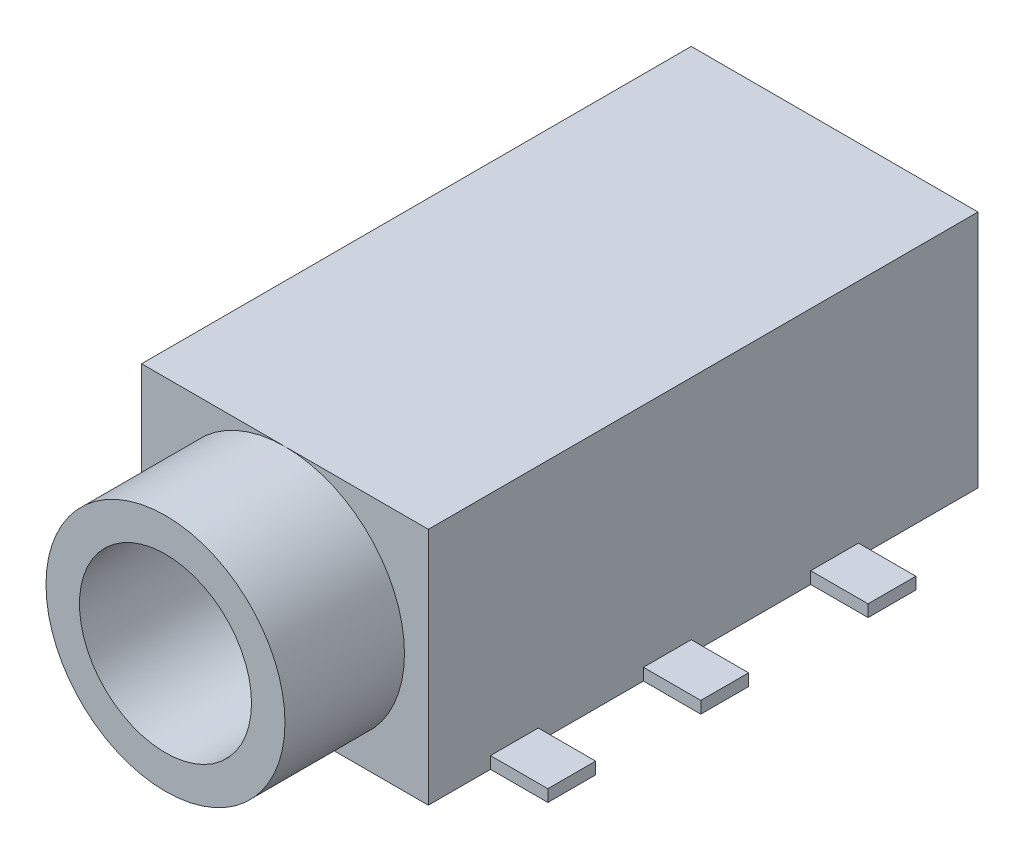
ISO-10303-21;
HEADER;
FILE_DESCRIPTION(('STEP AP214'),'2;1');
FILE_NAME('part.step','',(''),(''),'','','');
FILE_SCHEMA(('AUTOMOTIVE_DESIGN { 1 0 10303 214 1 1 1 1 }'));
ENDSEC;
DATA;
#1=APPLICATION_CONTEXT('core data for automotive mechanical design processes');
#2=APPLICATION_PROTOCOL_DEFINITION('international standard','automotive_design',2000,#1);
#3=PRODUCT_CONTEXT('',#1,'mechanical');
#4=PRODUCT('Part','Part','',(#3));
#5=PRODUCT_RELATED_PRODUCT_CATEGORY('part','',(#4));
#6=PRODUCT_DEFINITION_FORMATION('','',#4);
#7=PRODUCT_DEFINITION_CONTEXT('part definition',#1,'design');
#8=PRODUCT_DEFINITION('design','',#6,#7);
#9=PRODUCT_DEFINITION_SHAPE('','',#8);
#10=(LENGTH_UNIT() NAMED_UNIT(*) SI_UNIT(.MILLI.,.METRE.));
#11=(NAMED_UNIT(*) PLANE_ANGLE_UNIT() SI_UNIT($,.RADIAN.));
#12=(NAMED_UNIT(*) SI_UNIT($,.STERADIAN.) SOLID_ANGLE_UNIT());
#13=UNCERTAINTY_MEASURE_WITH_UNIT(LENGTH_MEASURE(1.E-05),#10,'distance_accuracy_value','');
#14=(GEOMETRIC_REPRESENTATION_CONTEXT(3) GLOBAL_UNCERTAINTY_ASSIGNED_CONTEXT((#13)) GLOBAL_UNIT_ASSIGNED_CONTEXT((#10,
#11,#12)) REPRESENTATION_CONTEXT('',''));
#15=CARTESIAN_POINT('',(0.,0.,0.));
#16=DIRECTION('',(0.,0.,1.));
#17=DIRECTION('',(1.,0.,0.));
#18=AXIS2_PLACEMENT_3D('',#15,#16,#17);
#19=CARTESIAN_POINT('',(3.,5.,0.));
#20=DIRECTION('',(-1.,0.,0.));
#21=DIRECTION('',(0.,0.,1.));
#22=AXIS2_PLACEMENT_3D('',#19,#20,#21);
#23=PLANE('',#22);
#24=DIRECTION('',(0.,-1.,0.));
#25=VECTOR('',#24,1.);
#26=CARTESIAN_POINT('',(3.,0.,-8.));
#27=LINE('',#26,#25);
#28=CARTESIAN_POINT('',(3.,0.250000000000001,-8.));
#29=VERTEX_POINT('',#28);
#30=CARTESIAN_POINT('',(3.,0.,-8.));
#31=VERTEX_POINT('',#30);
#32=EDGE_CURVE('E337',#29,#31,#27,.T.);
#33=ORIENTED_EDGE('',*,*,#32,.F.);
#34=DIRECTION('',(0.,0.,1.));
#35=VECTOR('',#34,1.);
#36=CARTESIAN_POINT('',(3.,0.25,-8.));
#37=LINE('',#36,#35);
#38=CARTESIAN_POINT('',(3.,0.250000000000001,-9.));
#39=VERTEX_POINT('',#38);
#40=EDGE_CURVE('E342',#39,#29,#37,.T.);
#41=ORIENTED_EDGE('',*,*,#40,.F.);
#42=DIRECTION('',(0.,1.,0.));
#43=VECTOR('',#42,1.);
#44=CARTESIAN_POINT('',(3.,0.,-9.));
#45=LINE('',#44,#43);
#46=CARTESIAN_POINT('',(3.,0.,-9.));
#47=VERTEX_POINT('',#46);
#48=EDGE_CURVE('E351',#47,#39,#45,.T.);
#49=ORIENTED_EDGE('',*,*,#48,.F.);
#50=DIRECTION('',(0.,0.,-1.));
#51=VECTOR('',#50,1.);
#52=CARTESIAN_POINT('',(3.,0.,0.));
#53=LINE('',#52,#51);
#54=CARTESIAN_POINT('',(3.,0.,-11.5));
#55=VERTEX_POINT('',#54);
#56=EDGE_CURVE('E441',#47,#55,#53,.T.);
#57=ORIENTED_EDGE('',*,*,#56,.T.);
#58=DIRECTION('',(0.,-1.,0.));
#59=VECTOR('',#58,1.);
#60=CARTESIAN_POINT('',(3.,5.,-11.5));
#61=LINE('',#60,#59);
#62=CARTESIAN_POINT('',(3.,5.,-11.5));
#63=VERTEX_POINT('',#62);
#64=EDGE_CURVE('E49',#63,#55,#61,.T.);
#65=ORIENTED_EDGE('',*,*,#64,.F.);
#66=DIRECTION('',(0.,0.,-1.));
#67=VECTOR('',#66,1.);
#68=CARTESIAN_POINT('',(3.,5.,0.));
#69=LINE('',#68,#67);
#70=CARTESIAN_POINT('',(3.,5.,0.));
#71=VERTEX_POINT('',#70);
#72=EDGE_CURVE('E444',#71,#63,#69,.T.);
#73=ORIENTED_EDGE('',*,*,#72,.F.);
#74=DIRECTION('',(0.,-1.,0.));
#75=VECTOR('',#74,1.);
#76=CARTESIAN_POINT('',(3.,5.,0.));
#77=LINE('',#76,#75);
#78=CARTESIAN_POINT('',(3.,0.,0.));
#79=VERTEX_POINT('',#78);
#80=EDGE_CURVE('E455',#71,#79,#77,.T.);
#81=ORIENTED_EDGE('',*,*,#80,.T.);
#82=CARTESIAN_POINT('',(3.,0.,-1.3));
#83=VERTEX_POINT('',#82);
#84=EDGE_CURVE('E456',#79,#83,#53,.T.);
#85=ORIENTED_EDGE('',*,*,#84,.T.);
#86=DIRECTION('',(0.,-1.,0.));
#87=VECTOR('',#86,1.);
#88=CARTESIAN_POINT('',(3.,0.,-1.3));
#89=LINE('',#88,#87);
#90=CARTESIAN_POINT('',(3.,0.25,-1.3));
#91=VERTEX_POINT('',#90);
#92=EDGE_CURVE('E397',#91,#83,#89,.T.);
#93=ORIENTED_EDGE('',*,*,#92,.F.);
#94=DIRECTION('',(0.,0.,1.));
#95=VECTOR('',#94,1.);
#96=CARTESIAN_POINT('',(3.,0.25,-1.3));
#97=LINE('',#96,#95);
#98=CARTESIAN_POINT('',(3.,0.25,-2.3));
#99=VERTEX_POINT('',#98);
#100=EDGE_CURVE('E402',#99,#91,#97,.T.);
#101=ORIENTED_EDGE('',*,*,#100,.F.);
#102=DIRECTION('',(0.,1.,0.));
#103=VECTOR('',#102,1.);
#104=CARTESIAN_POINT('',(3.,0.,-2.3));
#105=LINE('',#104,#103);
#106=CARTESIAN_POINT('',(3.,0.,-2.3));
#107=VERTEX_POINT('',#106);
#108=EDGE_CURVE('E411',#107,#99,#105,.T.);
#109=ORIENTED_EDGE('',*,*,#108,.F.);
#110=CARTESIAN_POINT('',(3.,0.,-4.5));
#111=VERTEX_POINT('',#110);
#112=EDGE_CURVE('E459',#107,#111,#53,.T.);
#113=ORIENTED_EDGE('',*,*,#112,.T.);
#114=DIRECTION('',(0.,-1.,0.));
#115=VECTOR('',#114,1.);
#116=CARTESIAN_POINT('',(3.,0.,-4.5));
#117=LINE('',#116,#115);
#118=CARTESIAN_POINT('',(3.,0.25,-4.5));
#119=VERTEX_POINT('',#118);
#120=EDGE_CURVE('E367',#119,#111,#117,.T.);
#121=ORIENTED_EDGE('',*,*,#120,.F.);
#122=DIRECTION('',(0.,0.,1.));
#123=VECTOR('',#122,1.);
#124=CARTESIAN_POINT('',(3.,0.25,-4.5));
#125=LINE('',#124,#123);
#126=CARTESIAN_POINT('',(3.,0.25,-5.5));
#127=VERTEX_POINT('',#126);
#128=EDGE_CURVE('E372',#127,#119,#125,.T.);
#129=ORIENTED_EDGE('',*,*,#128,.F.);
#130=DIRECTION('',(0.,1.,0.));
#131=VECTOR('',#130,1.);
#132=CARTESIAN_POINT('',(3.,0.,-5.5));
#133=LINE('',#132,#131);
#134=CARTESIAN_POINT('',(3.,0.,-5.5));
#135=VERTEX_POINT('',#134);
#136=EDGE_CURVE('E381',#135,#127,#133,.T.);
#137=ORIENTED_EDGE('',*,*,#136,.F.);
#138=EDGE_CURVE('E487',#135,#31,#53,.T.);
#139=ORIENTED_EDGE('',*,*,#138,.T.);
#140=EDGE_LOOP('',(#33,#41,#49,#57,#65,#73,#81,#85,#93,#101,#109,#113,#121,#129,#137,#139));
#141=FACE_BOUND('',#140,.T.);
#142=ADVANCED_FACE('F46',(#141),#23,.F.);
#143=CARTESIAN_POINT('',(-3.,5.,0.));
#144=DIRECTION('',(0.,0.,-1.));
#145=DIRECTION('',(-1.,0.,0.));
#146=AXIS2_PLACEMENT_3D('',#143,#144,#145);
#147=PLANE('',#146);
#148=CARTESIAN_POINT('',(0.,2.5,0.));
#149=DIRECTION('',(0.,0.,1.));
#150=DIRECTION('',(1.,0.,0.));
#151=AXIS2_PLACEMENT_3D('',#148,#149,#150);
#152=CIRCLE('',#151,2.5);
#153=CARTESIAN_POINT('',(0.,5.,0.));
#154=VERTEX_POINT('',#153);
#155=CARTESIAN_POINT('',(0.,0.,0.));
#156=VERTEX_POINT('',#155);
#157=EDGE_CURVE('E55',#154,#156,#152,.T.);
#158=ORIENTED_EDGE('',*,*,#157,.F.);
#159=DIRECTION('',(1.,0.,0.));
#160=VECTOR('',#159,1.);
#161=CARTESIAN_POINT('',(-3.,5.,0.));
#162=LINE('',#161,#160);
#163=CARTESIAN_POINT('',(-3.,5.,0.));
#164=VERTEX_POINT('',#163);
#165=EDGE_CURVE('E453',#164,#154,#162,.T.);
#166=ORIENTED_EDGE('',*,*,#165,.F.);
#167=DIRECTION('',(0.,-1.,0.));
#168=VECTOR('',#167,1.);
#169=CARTESIAN_POINT('',(-3.,5.,0.));
#170=LINE('',#169,#168);
#171=CARTESIAN_POINT('',(-3.,0.,0.));
#172=VERTEX_POINT('',#171);
#173=EDGE_CURVE('E470',#164,#172,#170,.T.);
#174=ORIENTED_EDGE('',*,*,#173,.T.);
#175=DIRECTION('',(1.,0.,0.));
#176=VECTOR('',#175,1.);
#177=CARTESIAN_POINT('',(-3.,0.,0.));
#178=LINE('',#177,#176);
#179=EDGE_CURVE('E448',#172,#156,#178,.T.);
#180=ORIENTED_EDGE('',*,*,#179,.T.);
#181=EDGE_LOOP('',(#158,#166,#174,#180));
#182=FACE_BOUND('',#181,.T.);
#183=ADVANCED_FACE('F501',(#182),#147,.F.);
#184=CARTESIAN_POINT('',(-3.,5.,-11.5));
#185=DIRECTION('',(0.,0.,1.));
#186=DIRECTION('',(1.,0.,0.));
#187=AXIS2_PLACEMENT_3D('',#184,#185,#186);
#188=PLANE('',#187);
#189=CARTESIAN_POINT('',(0.,2.5,-11.5));
#190=DIRECTION('',(0.,0.,1.));
#191=DIRECTION('',(1.,0.,0.));
#192=AXIS2_PLACEMENT_3D('',#189,#190,#191);
#193=CIRCLE('',#192,1.8);
#194=CARTESIAN_POINT('',(1.8,2.5,-11.5));
#195=VERTEX_POINT('',#194);
#196=EDGE_CURVE('E268',#195,#195,#193,.T.);
#197=ORIENTED_EDGE('',*,*,#196,.T.);
#198=EDGE_LOOP('',(#197));
#199=FACE_BOUND('',#198,.T.);
#200=DIRECTION('',(-1.,0.,0.));
#201=VECTOR('',#200,1.);
#202=CARTESIAN_POINT('',(-3.,0.,-11.5));
#203=LINE('',#202,#201);
#204=CARTESIAN_POINT('',(-3.,0.,-11.5));
#205=VERTEX_POINT('',#204);
#206=EDGE_CURVE('E458',#55,#205,#203,.T.);
#207=ORIENTED_EDGE('',*,*,#206,.T.);
#208=DIRECTION('',(0.,-1.,0.));
#209=VECTOR('',#208,1.);
#210=CARTESIAN_POINT('',(-3.,5.,-11.5));
#211=LINE('',#210,#209);
#212=CARTESIAN_POINT('',(-3.,5.,-11.5));
#213=VERTEX_POINT('',#212);
#214=EDGE_CURVE('E472',#213,#205,#211,.T.);
#215=ORIENTED_EDGE('',*,*,#214,.F.);
#216=DIRECTION('',(-1.,0.,0.));
#217=VECTOR('',#216,1.);
#218=CARTESIAN_POINT('',(-3.,5.,-11.5));
#219=LINE('',#218,#217);
#220=EDGE_CURVE('E447',#63,#213,#219,.T.);
#221=ORIENTED_EDGE('',*,*,#220,.F.);
#222=ORIENTED_EDGE('',*,*,#64,.T.);
#223=EDGE_LOOP('',(#207,#215,#221,#222));
#224=FACE_BOUND('',#223,.T.);
#225=ADVANCED_FACE('F480',(#199,#224),#188,.F.);
#226=CARTESIAN_POINT('',(-3.,5.,0.));
#227=DIRECTION('',(1.,0.,0.));
#228=DIRECTION('',(0.,0.,-1.));
#229=AXIS2_PLACEMENT_3D('',#226,#227,#228);
#230=PLANE('',#229);
#231=DIRECTION('',(0.,0.,1.));
#232=VECTOR('',#231,1.);
#233=CARTESIAN_POINT('',(-3.,0.25,-8.));
#234=LINE('',#233,#232);
#235=CARTESIAN_POINT('',(-3.,0.25,-9.));
#236=VERTEX_POINT('',#235);
#237=CARTESIAN_POINT('',(-3.,0.250000000000001,-8.));
#238=VERTEX_POINT('',#237);
#239=EDGE_CURVE('E62',#236,#238,#234,.T.);
#240=ORIENTED_EDGE('',*,*,#239,.T.);
#241=DIRECTION('',(0.,-1.,0.));
#242=VECTOR('',#241,1.);
#243=CARTESIAN_POINT('',(-3.,0.,-8.));
#244=LINE('',#243,#242);
#245=CARTESIAN_POINT('',(-3.,0.,-8.));
#246=VERTEX_POINT('',#245);
#247=EDGE_CURVE('E244',#238,#246,#244,.T.);
#248=ORIENTED_EDGE('',*,*,#247,.T.);
#249=DIRECTION('',(0.,0.,1.));
#250=VECTOR('',#249,1.);
#251=CARTESIAN_POINT('',(-3.,0.,0.));
#252=LINE('',#251,#250);
#253=CARTESIAN_POINT('',(-3.,0.,-5.5));
#254=VERTEX_POINT('',#253);
#255=EDGE_CURVE('E465',#246,#254,#252,.T.);
#256=ORIENTED_EDGE('',*,*,#255,.T.);
#257=DIRECTION('',(0.,1.,0.));
#258=VECTOR('',#257,1.);
#259=CARTESIAN_POINT('',(-3.,0.,-5.5));
#260=LINE('',#259,#258);
#261=CARTESIAN_POINT('',(-3.,0.25,-5.5));
#262=VERTEX_POINT('',#261);
#263=EDGE_CURVE('E280',#254,#262,#260,.T.);
#264=ORIENTED_EDGE('',*,*,#263,.T.);
#265=DIRECTION('',(0.,0.,1.));
#266=VECTOR('',#265,1.);
#267=CARTESIAN_POINT('',(-3.,0.25,-4.5));
#268=LINE('',#267,#266);
#269=CARTESIAN_POINT('',(-3.,0.25,-4.5));
#270=VERTEX_POINT('',#269);
#271=EDGE_CURVE('E292',#262,#270,#268,.T.);
#272=ORIENTED_EDGE('',*,*,#271,.T.);
#273=DIRECTION('',(0.,-1.,0.));
#274=VECTOR('',#273,1.);
#275=CARTESIAN_POINT('',(-3.,0.,-4.5));
#276=LINE('',#275,#274);
#277=CARTESIAN_POINT('',(-3.,0.,-4.5));
#278=VERTEX_POINT('',#277);
#279=EDGE_CURVE('E247',#270,#278,#276,.T.);
#280=ORIENTED_EDGE('',*,*,#279,.T.);
#281=CARTESIAN_POINT('',(-3.,0.,-2.3));
#282=VERTEX_POINT('',#281);
#283=EDGE_CURVE('E676',#278,#282,#252,.T.);
#284=ORIENTED_EDGE('',*,*,#283,.T.);
#285=DIRECTION('',(0.,1.,0.));
#286=VECTOR('',#285,1.);
#287=CARTESIAN_POINT('',(-3.,0.,-2.3));
#288=LINE('',#287,#286);
#289=CARTESIAN_POINT('',(-3.,0.25,-2.3));
#290=VERTEX_POINT('',#289);
#291=EDGE_CURVE('E311',#282,#290,#288,.T.);
#292=ORIENTED_EDGE('',*,*,#291,.T.);
#293=DIRECTION('',(0.,0.,1.));
#294=VECTOR('',#293,1.);
#295=CARTESIAN_POINT('',(-3.,0.25,-1.3));
#296=LINE('',#295,#294);
#297=CARTESIAN_POINT('',(-3.,0.25,-1.3));
#298=VERTEX_POINT('',#297);
#299=EDGE_CURVE('E323',#290,#298,#296,.T.);
#300=ORIENTED_EDGE('',*,*,#299,.T.);
#301=DIRECTION('',(0.,-1.,0.));
#302=VECTOR('',#301,1.);
#303=CARTESIAN_POINT('',(-3.,0.,-1.3));
#304=LINE('',#303,#302);
#305=CARTESIAN_POINT('',(-3.,0.,-1.3));
#306=VERTEX_POINT('',#305);
#307=EDGE_CURVE('E306',#298,#306,#304,.T.);
#308=ORIENTED_EDGE('',*,*,#307,.T.);
#309=EDGE_CURVE('E461',#306,#172,#252,.T.);
#310=ORIENTED_EDGE('',*,*,#309,.T.);
#311=ORIENTED_EDGE('',*,*,#173,.F.);
#312=DIRECTION('',(0.,0.,1.));
#313=VECTOR('',#312,1.);
#314=CARTESIAN_POINT('',(-3.,5.,0.));
#315=LINE('',#314,#313);
#316=EDGE_CURVE('E450',#213,#164,#315,.T.);
#317=ORIENTED_EDGE('',*,*,#316,.F.);
#318=ORIENTED_EDGE('',*,*,#214,.T.);
#319=CARTESIAN_POINT('',(-3.,0.,-9.));
#320=VERTEX_POINT('',#319);
#321=EDGE_CURVE('E462',#205,#320,#252,.T.);
#322=ORIENTED_EDGE('',*,*,#321,.T.);
#323=DIRECTION('',(0.,1.,0.));
#324=VECTOR('',#323,1.);
#325=CARTESIAN_POINT('',(-3.,0.,-9.));
#326=LINE('',#325,#324);
#327=EDGE_CURVE('E67',#320,#236,#326,.T.);
#328=ORIENTED_EDGE('',*,*,#327,.T.);
#329=EDGE_LOOP('',(#240,#248,#256,#264,#272,#280,#284,#292,#300,#308,#310,#311,#317,#318,#322,#328));
#330=FACE_BOUND('',#329,.T.);
#331=ADVANCED_FACE('F490',(#330),#230,.F.);
#332=EDGE_CURVE('E13',#156,#154,#152,.T.);
#333=ORIENTED_EDGE('',*,*,#332,.F.);
#334=EDGE_CURVE('E464',#156,#79,#178,.T.);
#335=ORIENTED_EDGE('',*,*,#334,.T.);
#336=ORIENTED_EDGE('',*,*,#80,.F.);
#337=EDGE_CURVE('E452',#154,#71,#162,.T.);
#338=ORIENTED_EDGE('',*,*,#337,.F.);
#339=EDGE_LOOP('',(#333,#335,#336,#338));
#340=FACE_BOUND('',#339,.T.);
#341=ADVANCED_FACE('F492',(#340),#147,.F.);
#342=CARTESIAN_POINT('',(0.,5.,0.));
#343=DIRECTION('',(0.,-1.,0.));
#344=DIRECTION('',(0.,0.,-1.));
#345=AXIS2_PLACEMENT_3D('',#342,#343,#344);
#346=PLANE('',#345);
#347=ORIENTED_EDGE('',*,*,#72,.T.);
#348=ORIENTED_EDGE('',*,*,#220,.T.);
#349=ORIENTED_EDGE('',*,*,#316,.T.);
#350=ORIENTED_EDGE('',*,*,#165,.T.);
#351=ORIENTED_EDGE('',*,*,#337,.T.);
#352=EDGE_LOOP('',(#347,#348,#349,#350,#351));
#353=FACE_BOUND('',#352,.T.);
#354=ADVANCED_FACE('F498',(#353),#346,.F.);
#355=CARTESIAN_POINT('',(0.,0.,0.));
#356=DIRECTION('',(0.,-1.,0.));
#357=DIRECTION('',(0.,0.,-1.));
#358=AXIS2_PLACEMENT_3D('',#355,#356,#357);
#359=PLANE('',#358);
#360=CARTESIAN_POINT('',(0.,0.,-8.5));
#361=DIRECTION('',(0.,-1.,0.));
#362=DIRECTION('',(0.,0.,-1.));
#363=AXIS2_PLACEMENT_3D('',#360,#361,#362);
#364=CIRCLE('',#363,0.75);
#365=CARTESIAN_POINT('',(0.,0.,-9.25));
#366=VERTEX_POINT('',#365);
#367=EDGE_CURVE('E427',#366,#366,#364,.T.);
#368=ORIENTED_EDGE('',*,*,#367,.F.);
#369=EDGE_LOOP('',(#368));
#370=FACE_BOUND('',#369,.T.);
#371=CARTESIAN_POINT('',(0.,0.,-2.5));
#372=DIRECTION('',(0.,-1.,0.));
#373=DIRECTION('',(0.,0.,-1.));
#374=AXIS2_PLACEMENT_3D('',#371,#372,#373);
#375=CIRCLE('',#374,0.75);
#376=CARTESIAN_POINT('',(0.,0.,-3.25));
#377=VERTEX_POINT('',#376);
#378=EDGE_CURVE('E431',#377,#377,#375,.T.);
#379=ORIENTED_EDGE('',*,*,#378,.F.);
#380=EDGE_LOOP('',(#379));
#381=FACE_BOUND('',#380,.T.);
#382=ORIENTED_EDGE('',*,*,#84,.F.);
#383=ORIENTED_EDGE('',*,*,#334,.F.);
#384=ORIENTED_EDGE('',*,*,#179,.F.);
#385=ORIENTED_EDGE('',*,*,#309,.F.);
#386=DIRECTION('',(1.,0.,0.));
#387=VECTOR('',#386,1.);
#388=CARTESIAN_POINT('',(-4.2,0.,-1.3));
#389=LINE('',#388,#387);
#390=CARTESIAN_POINT('',(-4.2,0.,-1.3));
#391=VERTEX_POINT('',#390);
#392=EDGE_CURVE('E320',#391,#306,#389,.T.);
#393=ORIENTED_EDGE('',*,*,#392,.F.);
#394=DIRECTION('',(0.,0.,-1.));
#395=VECTOR('',#394,1.);
#396=CARTESIAN_POINT('',(-4.2,0.,-1.3));
#397=LINE('',#396,#395);
#398=CARTESIAN_POINT('',(-4.2,0.,-2.3));
#399=VERTEX_POINT('',#398);
#400=EDGE_CURVE('E317',#391,#399,#397,.T.);
#401=ORIENTED_EDGE('',*,*,#400,.T.);
#402=DIRECTION('',(1.,0.,0.));
#403=VECTOR('',#402,1.);
#404=CARTESIAN_POINT('',(-4.2,0.,-2.3));
#405=LINE('',#404,#403);
#406=EDGE_CURVE('E329',#399,#282,#405,.T.);
#407=ORIENTED_EDGE('',*,*,#406,.T.);
#408=ORIENTED_EDGE('',*,*,#283,.F.);
#409=DIRECTION('',(1.,0.,0.));
#410=VECTOR('',#409,1.);
#411=CARTESIAN_POINT('',(-4.2,0.,-4.5));
#412=LINE('',#411,#410);
#413=CARTESIAN_POINT('',(-4.2,0.,-4.5));
#414=VERTEX_POINT('',#413);
#415=EDGE_CURVE('E289',#414,#278,#412,.T.);
#416=ORIENTED_EDGE('',*,*,#415,.F.);
#417=DIRECTION('',(0.,0.,-1.));
#418=VECTOR('',#417,1.);
#419=CARTESIAN_POINT('',(-4.2,0.,-4.5));
#420=LINE('',#419,#418);
#421=CARTESIAN_POINT('',(-4.2,0.,-5.5));
#422=VERTEX_POINT('',#421);
#423=EDGE_CURVE('E286',#414,#422,#420,.T.);
#424=ORIENTED_EDGE('',*,*,#423,.T.);
#425=DIRECTION('',(1.,0.,0.));
#426=VECTOR('',#425,1.);
#427=CARTESIAN_POINT('',(-4.2,0.,-5.5));
#428=LINE('',#427,#426);
#429=EDGE_CURVE('E297',#422,#254,#428,.T.);
#430=ORIENTED_EDGE('',*,*,#429,.T.);
#431=ORIENTED_EDGE('',*,*,#255,.F.);
#432=DIRECTION('',(1.,0.,0.));
#433=VECTOR('',#432,1.);
#434=CARTESIAN_POINT('',(-4.2,0.,-8.));
#435=LINE('',#434,#433);
#436=CARTESIAN_POINT('',(-4.2,0.,-8.));
#437=VERTEX_POINT('',#436);
#438=EDGE_CURVE('E266',#437,#246,#435,.T.);
#439=ORIENTED_EDGE('',*,*,#438,.F.);
#440=DIRECTION('',(0.,0.,-1.));
#441=VECTOR('',#440,1.);
#442=CARTESIAN_POINT('',(-4.2,0.,-8.));
#443=LINE('',#442,#441);
#444=CARTESIAN_POINT('',(-4.2,0.,-9.));
#445=VERTEX_POINT('',#444);
#446=EDGE_CURVE('E257',#437,#445,#443,.T.);
#447=ORIENTED_EDGE('',*,*,#446,.T.);
#448=DIRECTION('',(1.,0.,0.));
#449=VECTOR('',#448,1.);
#450=CARTESIAN_POINT('',(-4.2,0.,-9.));
#451=LINE('',#450,#449);
#452=EDGE_CURVE('E272',#445,#320,#451,.T.);
#453=ORIENTED_EDGE('',*,*,#452,.T.);
#454=ORIENTED_EDGE('',*,*,#321,.F.);
#455=ORIENTED_EDGE('',*,*,#206,.F.);
#456=ORIENTED_EDGE('',*,*,#56,.F.);
#457=DIRECTION('',(-1.,0.,0.));
#458=VECTOR('',#457,1.);
#459=CARTESIAN_POINT('',(4.2,0.,-9.));
#460=LINE('',#459,#458);
#461=CARTESIAN_POINT('',(4.2,0.,-9.));
#462=VERTEX_POINT('',#461);
#463=EDGE_CURVE('E361',#462,#47,#460,.T.);
#464=ORIENTED_EDGE('',*,*,#463,.F.);
#465=DIRECTION('',(0.,0.,-1.));
#466=VECTOR('',#465,1.);
#467=CARTESIAN_POINT('',(4.2,0.,-8.));
#468=LINE('',#467,#466);
#469=CARTESIAN_POINT('',(4.2,0.,-8.));
#470=VERTEX_POINT('',#469);
#471=EDGE_CURVE('E341',#470,#462,#468,.T.);
#472=ORIENTED_EDGE('',*,*,#471,.F.);
#473=DIRECTION('',(-1.,0.,0.));
#474=VECTOR('',#473,1.);
#475=CARTESIAN_POINT('',(4.2,0.,-8.));
#476=LINE('',#475,#474);
#477=EDGE_CURVE('E364',#470,#31,#476,.T.);
#478=ORIENTED_EDGE('',*,*,#477,.T.);
#479=ORIENTED_EDGE('',*,*,#138,.F.);
#480=DIRECTION('',(-1.,0.,0.));
#481=VECTOR('',#480,1.);
#482=CARTESIAN_POINT('',(4.2,0.,-5.5));
#483=LINE('',#482,#481);
#484=CARTESIAN_POINT('',(4.2,0.,-5.5));
#485=VERTEX_POINT('',#484);
#486=EDGE_CURVE('E391',#485,#135,#483,.T.);
#487=ORIENTED_EDGE('',*,*,#486,.F.);
#488=DIRECTION('',(0.,0.,-1.));
#489=VECTOR('',#488,1.);
#490=CARTESIAN_POINT('',(4.2,0.,-4.5));
#491=LINE('',#490,#489);
#492=CARTESIAN_POINT('',(4.2,0.,-4.5));
#493=VERTEX_POINT('',#492);
#494=EDGE_CURVE('E371',#493,#485,#491,.T.);
#495=ORIENTED_EDGE('',*,*,#494,.F.);
#496=DIRECTION('',(-1.,0.,0.));
#497=VECTOR('',#496,1.);
#498=CARTESIAN_POINT('',(4.2,0.,-4.5));
#499=LINE('',#498,#497);
#500=EDGE_CURVE('E394',#493,#111,#499,.T.);
#501=ORIENTED_EDGE('',*,*,#500,.T.);
#502=ORIENTED_EDGE('',*,*,#112,.F.);
#503=DIRECTION('',(-1.,0.,0.));
#504=VECTOR('',#503,1.);
#505=CARTESIAN_POINT('',(4.2,0.,-2.3));
#506=LINE('',#505,#504);
#507=CARTESIAN_POINT('',(4.2,0.,-2.3));
#508=VERTEX_POINT('',#507);
#509=EDGE_CURVE('E421',#508,#107,#506,.T.);
#510=ORIENTED_EDGE('',*,*,#509,.F.);
#511=DIRECTION('',(0.,0.,-1.));
#512=VECTOR('',#511,1.);
#513=CARTESIAN_POINT('',(4.2,0.,-1.3));
#514=LINE('',#513,#512);
#515=CARTESIAN_POINT('',(4.2,0.,-1.3));
#516=VERTEX_POINT('',#515);
#517=EDGE_CURVE('E401',#516,#508,#514,.T.);
#518=ORIENTED_EDGE('',*,*,#517,.F.);
#519=DIRECTION('',(-1.,0.,0.));
#520=VECTOR('',#519,1.);
#521=CARTESIAN_POINT('',(4.2,0.,-1.3));
#522=LINE('',#521,#520);
#523=EDGE_CURVE('E424',#516,#83,#522,.T.);
#524=ORIENTED_EDGE('',*,*,#523,.T.);
#525=EDGE_LOOP('',(#382,#383,#384,#385,#393,#401,#407,#408,#416,#424,#430,#431,#439,#447,#453,
#454,#455,#456,#464,#472,#478,#479,#487,#495,#501,#502,#510,#518,#524));
#526=FACE_BOUND('',#525,.T.);
#527=ADVANCED_FACE('F489',(#370,#381,#526),#359,.T.);
#528=CARTESIAN_POINT('',(0.,2.5,2.5));
#529=DIRECTION('',(0.,0.,-1.));
#530=DIRECTION('',(-1.,0.,0.));
#531=AXIS2_PLACEMENT_3D('',#528,#529,#530);
#532=CYLINDRICAL_SURFACE('',#531,2.5);
#533=CARTESIAN_POINT('',(0.,2.5,2.5));
#534=DIRECTION('',(0.,0.,1.));
#535=DIRECTION('',(1.,0.,0.));
#536=AXIS2_PLACEMENT_3D('',#533,#534,#535);
#537=CIRCLE('',#536,2.5);
#538=CARTESIAN_POINT('',(2.5,2.5,2.5));
#539=VERTEX_POINT('',#538);
#540=EDGE_CURVE('E439',#539,#539,#537,.T.);
#541=ORIENTED_EDGE('',*,*,#540,.F.);
#542=EDGE_LOOP('',(#541));
#543=FACE_BOUND('',#542,.T.);
#544=ORIENTED_EDGE('',*,*,#157,.T.);
#545=ORIENTED_EDGE('',*,*,#332,.T.);
#546=EDGE_LOOP('',(#544,#545));
#547=FACE_BOUND('',#546,.T.);
#548=ADVANCED_FACE('F514',(#543,#547),#532,.T.);
#549=CARTESIAN_POINT('',(0.,2.5,2.5));
#550=DIRECTION('',(0.,0.,1.));
#551=DIRECTION('',(1.,0.,0.));
#552=AXIS2_PLACEMENT_3D('',#549,#550,#551);
#553=PLANE('',#552);
#554=CARTESIAN_POINT('',(0.,2.5,2.5));
#555=DIRECTION('',(0.,0.,1.));
#556=DIRECTION('',(1.,0.,0.));
#557=AXIS2_PLACEMENT_3D('',#554,#555,#556);
#558=CIRCLE('',#557,1.8);
#559=CARTESIAN_POINT('',(1.8,2.5,2.5));
#560=VERTEX_POINT('',#559);
#561=EDGE_CURVE('E642',#560,#560,#558,.T.);
#562=ORIENTED_EDGE('',*,*,#561,.F.);
#563=EDGE_LOOP('',(#562));
#564=FACE_BOUND('',#563,.T.);
#565=ORIENTED_EDGE('',*,*,#540,.T.);
#566=EDGE_LOOP('',(#565));
#567=FACE_BOUND('',#566,.T.);
#568=ADVANCED_FACE('F521',(#564,#567),#553,.T.);
#569=CARTESIAN_POINT('',(0.,-0.5,-2.5));
#570=DIRECTION('',(0.,1.,0.));
#571=DIRECTION('',(0.,0.,1.));
#572=AXIS2_PLACEMENT_3D('',#569,#570,#571);
#573=CYLINDRICAL_SURFACE('',#572,0.75);
#574=CARTESIAN_POINT('',(0.,-0.5,-2.5));
#575=DIRECTION('',(0.,-1.,0.));
#576=DIRECTION('',(0.,0.,-1.));
#577=AXIS2_PLACEMENT_3D('',#574,#575,#576);
#578=CIRCLE('',#577,0.75);
#579=CARTESIAN_POINT('',(0.,-0.5,-3.25));
#580=VERTEX_POINT('',#579);
#581=EDGE_CURVE('E434',#580,#580,#578,.T.);
#582=ORIENTED_EDGE('',*,*,#581,.F.);
#583=EDGE_LOOP('',(#582));
#584=FACE_BOUND('',#583,.T.);
#585=ORIENTED_EDGE('',*,*,#378,.T.);
#586=EDGE_LOOP('',(#585));
#587=FACE_BOUND('',#586,.T.);
#588=ADVANCED_FACE('F525',(#584,#587),#573,.T.);
#589=CARTESIAN_POINT('',(0.,-0.5,-2.5));
#590=DIRECTION('',(0.,-1.,0.));
#591=DIRECTION('',(0.,0.,-1.));
#592=AXIS2_PLACEMENT_3D('',#589,#590,#591);
#593=PLANE('',#592);
#594=ORIENTED_EDGE('',*,*,#581,.T.);
#595=EDGE_LOOP('',(#594));
#596=FACE_BOUND('',#595,.T.);
#597=ADVANCED_FACE('F529',(#596),#593,.T.);
#598=CARTESIAN_POINT('',(0.,-0.5,-8.5));
#599=DIRECTION('',(0.,1.,0.));
#600=DIRECTION('',(0.,0.,1.));
#601=AXIS2_PLACEMENT_3D('',#598,#599,#600);
#602=CYLINDRICAL_SURFACE('',#601,0.75);
#603=CARTESIAN_POINT('',(0.,-0.5,-8.5));
#604=DIRECTION('',(0.,-1.,0.));
#605=DIRECTION('',(0.,0.,-1.));
#606=AXIS2_PLACEMENT_3D('',#603,#604,#605);
#607=CIRCLE('',#606,0.75);
#608=CARTESIAN_POINT('',(0.,-0.5,-9.25));
#609=VERTEX_POINT('',#608);
#610=EDGE_CURVE('E428',#609,#609,#607,.T.);
#611=ORIENTED_EDGE('',*,*,#610,.F.);
#612=EDGE_LOOP('',(#611));
#613=FACE_BOUND('',#612,.T.);
#614=ORIENTED_EDGE('',*,*,#367,.T.);
#615=EDGE_LOOP('',(#614));
#616=FACE_BOUND('',#615,.T.);
#617=ADVANCED_FACE('F533',(#613,#616),#602,.T.);
#618=CARTESIAN_POINT('',(0.,-0.5,-8.5));
#619=DIRECTION('',(0.,-1.,0.));
#620=DIRECTION('',(0.,0.,-1.));
#621=AXIS2_PLACEMENT_3D('',#618,#619,#620);
#622=PLANE('',#621);
#623=ORIENTED_EDGE('',*,*,#610,.T.);
#624=EDGE_LOOP('',(#623));
#625=FACE_BOUND('',#624,.T.);
#626=ADVANCED_FACE('F537',(#625),#622,.T.);
#627=CARTESIAN_POINT('',(4.2,0.,-1.3));
#628=DIRECTION('',(0.,0.,-1.));
#629=DIRECTION('',(-1.,0.,0.));
#630=AXIS2_PLACEMENT_3D('',#627,#628,#629);
#631=PLANE('',#630);
#632=ORIENTED_EDGE('',*,*,#92,.T.);
#633=ORIENTED_EDGE('',*,*,#523,.F.);
#634=DIRECTION('',(0.,-1.,0.));
#635=VECTOR('',#634,1.);
#636=CARTESIAN_POINT('',(4.2,0.,-1.3));
#637=LINE('',#636,#635);
#638=CARTESIAN_POINT('',(4.2,0.25,-1.3));
#639=VERTEX_POINT('',#638);
#640=EDGE_CURVE('E398',#639,#516,#637,.T.);
#641=ORIENTED_EDGE('',*,*,#640,.F.);
#642=DIRECTION('',(-1.,0.,0.));
#643=VECTOR('',#642,1.);
#644=CARTESIAN_POINT('',(4.2,0.25,-1.3));
#645=LINE('',#644,#643);
#646=EDGE_CURVE('E408',#639,#91,#645,.T.);
#647=ORIENTED_EDGE('',*,*,#646,.T.);
#648=EDGE_LOOP('',(#632,#633,#641,#647));
#649=FACE_BOUND('',#648,.T.);
#650=ADVANCED_FACE('F541',(#649),#631,.F.);
#651=CARTESIAN_POINT('',(4.2,0.,-2.3));
#652=DIRECTION('',(0.,0.,1.));
#653=DIRECTION('',(0.,-1.,0.));
#654=AXIS2_PLACEMENT_3D('',#651,#652,#653);
#655=PLANE('',#654);
#656=ORIENTED_EDGE('',*,*,#108,.T.);
#657=DIRECTION('',(-1.,0.,0.));
#658=VECTOR('',#657,1.);
#659=CARTESIAN_POINT('',(4.2,0.25,-2.3));
#660=LINE('',#659,#658);
#661=CARTESIAN_POINT('',(4.2,0.25,-2.3));
#662=VERTEX_POINT('',#661);
#663=EDGE_CURVE('E418',#662,#99,#660,.T.);
#664=ORIENTED_EDGE('',*,*,#663,.F.);
#665=DIRECTION('',(0.,1.,0.));
#666=VECTOR('',#665,1.);
#667=CARTESIAN_POINT('',(4.2,0.,-2.3));
#668=LINE('',#667,#666);
#669=EDGE_CURVE('E404',#508,#662,#668,.T.);
#670=ORIENTED_EDGE('',*,*,#669,.F.);
#671=ORIENTED_EDGE('',*,*,#509,.T.);
#672=EDGE_LOOP('',(#656,#664,#670,#671));
#673=FACE_BOUND('',#672,.T.);
#674=ADVANCED_FACE('F545',(#673),#655,.F.);
#675=CARTESIAN_POINT('',(4.2,0.25,-1.3));
#676=DIRECTION('',(0.,-1.,0.));
#677=DIRECTION('',(0.,0.,-1.));
#678=AXIS2_PLACEMENT_3D('',#675,#676,#677);
#679=PLANE('',#678);
#680=ORIENTED_EDGE('',*,*,#100,.T.);
#681=ORIENTED_EDGE('',*,*,#646,.F.);
#682=DIRECTION('',(0.,0.,1.));
#683=VECTOR('',#682,1.);
#684=CARTESIAN_POINT('',(4.2,0.25,-1.3));
#685=LINE('',#684,#683);
#686=EDGE_CURVE('E406',#662,#639,#685,.T.);
#687=ORIENTED_EDGE('',*,*,#686,.F.);
#688=ORIENTED_EDGE('',*,*,#663,.T.);
#689=EDGE_LOOP('',(#680,#681,#687,#688));
#690=FACE_BOUND('',#689,.T.);
#691=ADVANCED_FACE('F549',(#690),#679,.F.);
#692=CARTESIAN_POINT('',(4.2,0.,0.));
#693=DIRECTION('',(-1.,0.,0.));
#694=DIRECTION('',(0.,0.,1.));
#695=AXIS2_PLACEMENT_3D('',#692,#693,#694);
#696=PLANE('',#695);
#697=ORIENTED_EDGE('',*,*,#640,.T.);
#698=ORIENTED_EDGE('',*,*,#517,.T.);
#699=ORIENTED_EDGE('',*,*,#669,.T.);
#700=ORIENTED_EDGE('',*,*,#686,.T.);
#701=EDGE_LOOP('',(#697,#698,#699,#700));
#702=FACE_BOUND('',#701,.T.);
#703=ADVANCED_FACE('F553',(#702),#696,.F.);
#704=CARTESIAN_POINT('',(4.2,0.,-4.5));
#705=DIRECTION('',(0.,0.,-1.));
#706=DIRECTION('',(-1.,0.,0.));
#707=AXIS2_PLACEMENT_3D('',#704,#705,#706);
#708=PLANE('',#707);
#709=ORIENTED_EDGE('',*,*,#120,.T.);
#710=ORIENTED_EDGE('',*,*,#500,.F.);
#711=DIRECTION('',(0.,-1.,0.));
#712=VECTOR('',#711,1.);
#713=CARTESIAN_POINT('',(4.2,0.,-4.5));
#714=LINE('',#713,#712);
#715=CARTESIAN_POINT('',(4.2,0.25,-4.5));
#716=VERTEX_POINT('',#715);
#717=EDGE_CURVE('E368',#716,#493,#714,.T.);
#718=ORIENTED_EDGE('',*,*,#717,.F.);
#719=DIRECTION('',(-1.,0.,0.));
#720=VECTOR('',#719,1.);
#721=CARTESIAN_POINT('',(4.2,0.25,-4.5));
#722=LINE('',#721,#720);
#723=EDGE_CURVE('E378',#716,#119,#722,.T.);
#724=ORIENTED_EDGE('',*,*,#723,.T.);
#725=EDGE_LOOP('',(#709,#710,#718,#724));
#726=FACE_BOUND('',#725,.T.);
#727=ADVANCED_FACE('F557',(#726),#708,.F.);
#728=CARTESIAN_POINT('',(4.2,0.,-5.5));
#729=DIRECTION('',(0.,0.,1.));
#730=DIRECTION('',(1.,0.,0.));
#731=AXIS2_PLACEMENT_3D('',#728,#729,#730);
#732=PLANE('',#731);
#733=ORIENTED_EDGE('',*,*,#136,.T.);
#734=DIRECTION('',(-1.,0.,0.));
#735=VECTOR('',#734,1.);
#736=CARTESIAN_POINT('',(4.2,0.25,-5.5));
#737=LINE('',#736,#735);
#738=CARTESIAN_POINT('',(4.2,0.25,-5.5));
#739=VERTEX_POINT('',#738);
#740=EDGE_CURVE('E388',#739,#127,#737,.T.);
#741=ORIENTED_EDGE('',*,*,#740,.F.);
#742=DIRECTION('',(0.,1.,0.));
#743=VECTOR('',#742,1.);
#744=CARTESIAN_POINT('',(4.2,0.,-5.5));
#745=LINE('',#744,#743);
#746=EDGE_CURVE('E374',#485,#739,#745,.T.);
#747=ORIENTED_EDGE('',*,*,#746,.F.);
#748=ORIENTED_EDGE('',*,*,#486,.T.);
#749=EDGE_LOOP('',(#733,#741,#747,#748));
#750=FACE_BOUND('',#749,.T.);
#751=ADVANCED_FACE('F561',(#750),#732,.F.);
#752=CARTESIAN_POINT('',(4.2,0.25,-4.5));
#753=DIRECTION('',(0.,-1.,0.));
#754=DIRECTION('',(0.,0.,-1.));
#755=AXIS2_PLACEMENT_3D('',#752,#753,#754);
#756=PLANE('',#755);
#757=ORIENTED_EDGE('',*,*,#128,.T.);
#758=ORIENTED_EDGE('',*,*,#723,.F.);
#759=DIRECTION('',(0.,0.,1.));
#760=VECTOR('',#759,1.);
#761=CARTESIAN_POINT('',(4.2,0.25,-4.5));
#762=LINE('',#761,#760);
#763=EDGE_CURVE('E376',#739,#716,#762,.T.);
#764=ORIENTED_EDGE('',*,*,#763,.F.);
#765=ORIENTED_EDGE('',*,*,#740,.T.);
#766=EDGE_LOOP('',(#757,#758,#764,#765));
#767=FACE_BOUND('',#766,.T.);
#768=ADVANCED_FACE('F565',(#767),#756,.F.);
#769=CARTESIAN_POINT('',(4.2,0.,0.));
#770=DIRECTION('',(-1.,0.,0.));
#771=DIRECTION('',(0.,0.,1.));
#772=AXIS2_PLACEMENT_3D('',#769,#770,#771);
#773=PLANE('',#772);
#774=ORIENTED_EDGE('',*,*,#717,.T.);
#775=ORIENTED_EDGE('',*,*,#494,.T.);
#776=ORIENTED_EDGE('',*,*,#746,.T.);
#777=ORIENTED_EDGE('',*,*,#763,.T.);
#778=EDGE_LOOP('',(#774,#775,#776,#777));
#779=FACE_BOUND('',#778,.T.);
#780=ADVANCED_FACE('F569',(#779),#773,.F.);
#781=CARTESIAN_POINT('',(4.2,0.,-8.));
#782=DIRECTION('',(0.,0.,-1.));
#783=DIRECTION('',(-1.,0.,0.));
#784=AXIS2_PLACEMENT_3D('',#781,#782,#783);
#785=PLANE('',#784);
#786=ORIENTED_EDGE('',*,*,#32,.T.);
#787=ORIENTED_EDGE('',*,*,#477,.F.);
#788=DIRECTION('',(0.,-1.,0.));
#789=VECTOR('',#788,1.);
#790=CARTESIAN_POINT('',(4.2,0.,-8.));
#791=LINE('',#790,#789);
#792=CARTESIAN_POINT('',(4.2,0.25,-8.));
#793=VERTEX_POINT('',#792);
#794=EDGE_CURVE('E338',#793,#470,#791,.T.);
#795=ORIENTED_EDGE('',*,*,#794,.F.);
#796=DIRECTION('',(-1.,0.,0.));
#797=VECTOR('',#796,1.);
#798=CARTESIAN_POINT('',(4.2,0.25,-8.));
#799=LINE('',#798,#797);
#800=EDGE_CURVE('E348',#793,#29,#799,.T.);
#801=ORIENTED_EDGE('',*,*,#800,.T.);
#802=EDGE_LOOP('',(#786,#787,#795,#801));
#803=FACE_BOUND('',#802,.T.);
#804=ADVANCED_FACE('F573',(#803),#785,.F.);
#805=CARTESIAN_POINT('',(4.2,0.,-9.));
#806=DIRECTION('',(0.,0.,1.));
#807=DIRECTION('',(1.,0.,0.));
#808=AXIS2_PLACEMENT_3D('',#805,#806,#807);
#809=PLANE('',#808);
#810=ORIENTED_EDGE('',*,*,#48,.T.);
#811=DIRECTION('',(-1.,0.,0.));
#812=VECTOR('',#811,1.);
#813=CARTESIAN_POINT('',(4.2,0.25,-9.));
#814=LINE('',#813,#812);
#815=CARTESIAN_POINT('',(4.2,0.25,-9.));
#816=VERTEX_POINT('',#815);
#817=EDGE_CURVE('E358',#816,#39,#814,.T.);
#818=ORIENTED_EDGE('',*,*,#817,.F.);
#819=DIRECTION('',(0.,1.,0.));
#820=VECTOR('',#819,1.);
#821=CARTESIAN_POINT('',(4.2,0.,-9.));
#822=LINE('',#821,#820);
#823=EDGE_CURVE('E344',#462,#816,#822,.T.);
#824=ORIENTED_EDGE('',*,*,#823,.F.);
#825=ORIENTED_EDGE('',*,*,#463,.T.);
#826=EDGE_LOOP('',(#810,#818,#824,#825));
#827=FACE_BOUND('',#826,.T.);
#828=ADVANCED_FACE('F577',(#827),#809,.F.);
#829=CARTESIAN_POINT('',(4.2,0.25,-8.));
#830=DIRECTION('',(0.,-1.,0.));
#831=DIRECTION('',(0.,0.,-1.));
#832=AXIS2_PLACEMENT_3D('',#829,#830,#831);
#833=PLANE('',#832);
#834=ORIENTED_EDGE('',*,*,#40,.T.);
#835=ORIENTED_EDGE('',*,*,#800,.F.);
#836=DIRECTION('',(0.,0.,1.));
#837=VECTOR('',#836,1.);
#838=CARTESIAN_POINT('',(4.2,0.25,-8.));
#839=LINE('',#838,#837);
#840=EDGE_CURVE('E346',#816,#793,#839,.T.);
#841=ORIENTED_EDGE('',*,*,#840,.F.);
#842=ORIENTED_EDGE('',*,*,#817,.T.);
#843=EDGE_LOOP('',(#834,#835,#841,#842));
#844=FACE_BOUND('',#843,.T.);
#845=ADVANCED_FACE('F581',(#844),#833,.F.);
#846=CARTESIAN_POINT('',(4.2,0.,0.));
#847=DIRECTION('',(-1.,0.,0.));
#848=DIRECTION('',(0.,0.,1.));
#849=AXIS2_PLACEMENT_3D('',#846,#847,#848);
#850=PLANE('',#849);
#851=ORIENTED_EDGE('',*,*,#794,.T.);
#852=ORIENTED_EDGE('',*,*,#471,.T.);
#853=ORIENTED_EDGE('',*,*,#823,.T.);
#854=ORIENTED_EDGE('',*,*,#840,.T.);
#855=EDGE_LOOP('',(#851,#852,#853,#854));
#856=FACE_BOUND('',#855,.T.);
#857=ADVANCED_FACE('F585',(#856),#850,.F.);
#858=CARTESIAN_POINT('',(-4.2,0.,-1.3));
#859=DIRECTION('',(0.,0.,1.));
#860=DIRECTION('',(1.,0.,0.));
#861=AXIS2_PLACEMENT_3D('',#858,#859,#860);
#862=PLANE('',#861);
#863=ORIENTED_EDGE('',*,*,#307,.F.);
#864=DIRECTION('',(1.,0.,0.));
#865=VECTOR('',#864,1.);
#866=CARTESIAN_POINT('',(-4.2,0.25,-1.3));
#867=LINE('',#866,#865);
#868=CARTESIAN_POINT('',(-4.2,0.25,-1.3));
#869=VERTEX_POINT('',#868);
#870=EDGE_CURVE('E334',#869,#298,#867,.T.);
#871=ORIENTED_EDGE('',*,*,#870,.F.);
#872=DIRECTION('',(0.,-1.,0.));
#873=VECTOR('',#872,1.);
#874=CARTESIAN_POINT('',(-4.2,0.,-1.3));
#875=LINE('',#874,#873);
#876=EDGE_CURVE('E307',#869,#391,#875,.T.);
#877=ORIENTED_EDGE('',*,*,#876,.T.);
#878=ORIENTED_EDGE('',*,*,#392,.T.);
#879=EDGE_LOOP('',(#863,#871,#877,#878));
#880=FACE_BOUND('',#879,.T.);
#881=ADVANCED_FACE('F589',(#880),#862,.T.);
#882=CARTESIAN_POINT('',(-4.2,0.25,-1.3));
#883=DIRECTION('',(0.,1.,0.));
#884=DIRECTION('',(0.,0.,1.));
#885=AXIS2_PLACEMENT_3D('',#882,#883,#884);
#886=PLANE('',#885);
#887=ORIENTED_EDGE('',*,*,#299,.F.);
#888=DIRECTION('',(1.,0.,0.));
#889=VECTOR('',#888,1.);
#890=CARTESIAN_POINT('',(-4.2,0.25,-2.3));
#891=LINE('',#890,#889);
#892=CARTESIAN_POINT('',(-4.2,0.25,-2.3));
#893=VERTEX_POINT('',#892);
#894=EDGE_CURVE('E332',#893,#290,#891,.T.);
#895=ORIENTED_EDGE('',*,*,#894,.F.);
#896=DIRECTION('',(0.,0.,1.));
#897=VECTOR('',#896,1.);
#898=CARTESIAN_POINT('',(-4.2,0.25,-1.3));
#899=LINE('',#898,#897);
#900=EDGE_CURVE('E310',#893,#869,#899,.T.);
#901=ORIENTED_EDGE('',*,*,#900,.T.);
#902=ORIENTED_EDGE('',*,*,#870,.T.);
#903=EDGE_LOOP('',(#887,#895,#901,#902));
#904=FACE_BOUND('',#903,.T.);
#905=ADVANCED_FACE('F593',(#904),#886,.T.);
#906=CARTESIAN_POINT('',(-4.2,0.,-2.3));
#907=DIRECTION('',(0.,0.,-1.));
#908=DIRECTION('',(0.,1.,0.));
#909=AXIS2_PLACEMENT_3D('',#906,#907,#908);
#910=PLANE('',#909);
#911=ORIENTED_EDGE('',*,*,#291,.F.);
#912=ORIENTED_EDGE('',*,*,#406,.F.);
#913=DIRECTION('',(0.,1.,0.));
#914=VECTOR('',#913,1.);
#915=CARTESIAN_POINT('',(-4.2,0.,-2.3));
#916=LINE('',#915,#914);
#917=EDGE_CURVE('E314',#399,#893,#916,.T.);
#918=ORIENTED_EDGE('',*,*,#917,.T.);
#919=ORIENTED_EDGE('',*,*,#894,.T.);
#920=EDGE_LOOP('',(#911,#912,#918,#919));
#921=FACE_BOUND('',#920,.T.);
#922=ADVANCED_FACE('F597',(#921),#910,.T.);
#923=CARTESIAN_POINT('',(-4.2,0.,0.));
#924=DIRECTION('',(1.,0.,0.));
#925=DIRECTION('',(0.,0.,1.));
#926=AXIS2_PLACEMENT_3D('',#923,#924,#925);
#927=PLANE('',#926);
#928=ORIENTED_EDGE('',*,*,#876,.F.);
#929=ORIENTED_EDGE('',*,*,#900,.F.);
#930=ORIENTED_EDGE('',*,*,#917,.F.);
#931=ORIENTED_EDGE('',*,*,#400,.F.);
#932=EDGE_LOOP('',(#928,#929,#930,#931));
#933=FACE_BOUND('',#932,.T.);
#934=ADVANCED_FACE('F601',(#933),#927,.F.);
#935=CARTESIAN_POINT('',(-4.2,0.,-4.5));
#936=DIRECTION('',(0.,0.,1.));
#937=DIRECTION('',(1.,0.,0.));
#938=AXIS2_PLACEMENT_3D('',#935,#936,#937);
#939=PLANE('',#938);
#940=ORIENTED_EDGE('',*,*,#279,.F.);
#941=DIRECTION('',(1.,0.,0.));
#942=VECTOR('',#941,1.);
#943=CARTESIAN_POINT('',(-4.2,0.25,-4.5));
#944=LINE('',#943,#942);
#945=CARTESIAN_POINT('',(-4.2,0.25,-4.5));
#946=VERTEX_POINT('',#945);
#947=EDGE_CURVE('E303',#946,#270,#944,.T.);
#948=ORIENTED_EDGE('',*,*,#947,.F.);
#949=DIRECTION('',(0.,-1.,0.));
#950=VECTOR('',#949,1.);
#951=CARTESIAN_POINT('',(-4.2,0.,-4.5));
#952=LINE('',#951,#950);
#953=EDGE_CURVE('E276',#946,#414,#952,.T.);
#954=ORIENTED_EDGE('',*,*,#953,.T.);
#955=ORIENTED_EDGE('',*,*,#415,.T.);
#956=EDGE_LOOP('',(#940,#948,#954,#955));
#957=FACE_BOUND('',#956,.T.);
#958=ADVANCED_FACE('F605',(#957),#939,.T.);
#959=CARTESIAN_POINT('',(-4.2,0.25,-4.5));
#960=DIRECTION('',(0.,1.,0.));
#961=DIRECTION('',(0.,0.,1.));
#962=AXIS2_PLACEMENT_3D('',#959,#960,#961);
#963=PLANE('',#962);
#964=ORIENTED_EDGE('',*,*,#271,.F.);
#965=DIRECTION('',(1.,0.,0.));
#966=VECTOR('',#965,1.);
#967=CARTESIAN_POINT('',(-4.2,0.25,-5.5));
#968=LINE('',#967,#966);
#969=CARTESIAN_POINT('',(-4.2,0.25,-5.5));
#970=VERTEX_POINT('',#969);
#971=EDGE_CURVE('E300',#970,#262,#968,.T.);
#972=ORIENTED_EDGE('',*,*,#971,.F.);
#973=DIRECTION('',(0.,0.,1.));
#974=VECTOR('',#973,1.);
#975=CARTESIAN_POINT('',(-4.2,0.25,-4.5));
#976=LINE('',#975,#974);
#977=EDGE_CURVE('E279',#970,#946,#976,.T.);
#978=ORIENTED_EDGE('',*,*,#977,.T.);
#979=ORIENTED_EDGE('',*,*,#947,.T.);
#980=EDGE_LOOP('',(#964,#972,#978,#979));
#981=FACE_BOUND('',#980,.T.);
#982=ADVANCED_FACE('F609',(#981),#963,.T.);
#983=CARTESIAN_POINT('',(-4.2,0.,-5.5));
#984=DIRECTION('',(0.,0.,-1.));
#985=DIRECTION('',(-1.,0.,0.));
#986=AXIS2_PLACEMENT_3D('',#983,#984,#985);
#987=PLANE('',#986);
#988=ORIENTED_EDGE('',*,*,#263,.F.);
#989=ORIENTED_EDGE('',*,*,#429,.F.);
#990=DIRECTION('',(0.,1.,0.));
#991=VECTOR('',#990,1.);
#992=CARTESIAN_POINT('',(-4.2,0.,-5.5));
#993=LINE('',#992,#991);
#994=EDGE_CURVE('E283',#422,#970,#993,.T.);
#995=ORIENTED_EDGE('',*,*,#994,.T.);
#996=ORIENTED_EDGE('',*,*,#971,.T.);
#997=EDGE_LOOP('',(#988,#989,#995,#996));
#998=FACE_BOUND('',#997,.T.);
#999=ADVANCED_FACE('F613',(#998),#987,.T.);
#1000=CARTESIAN_POINT('',(-4.2,0.,0.));
#1001=DIRECTION('',(1.,0.,0.));
#1002=DIRECTION('',(0.,0.,1.));
#1003=AXIS2_PLACEMENT_3D('',#1000,#1001,#1002);
#1004=PLANE('',#1003);
#1005=ORIENTED_EDGE('',*,*,#953,.F.);
#1006=ORIENTED_EDGE('',*,*,#977,.F.);
#1007=ORIENTED_EDGE('',*,*,#994,.F.);
#1008=ORIENTED_EDGE('',*,*,#423,.F.);
#1009=EDGE_LOOP('',(#1005,#1006,#1007,#1008));
#1010=FACE_BOUND('',#1009,.T.);
#1011=ADVANCED_FACE('F617',(#1010),#1004,.F.);
#1012=CARTESIAN_POINT('',(-4.2,0.,-8.));
#1013=DIRECTION('',(0.,0.,1.));
#1014=DIRECTION('',(1.,0.,0.));
#1015=AXIS2_PLACEMENT_3D('',#1012,#1013,#1014);
#1016=PLANE('',#1015);
#1017=ORIENTED_EDGE('',*,*,#247,.F.);
#1018=DIRECTION('',(1.,0.,0.));
#1019=VECTOR('',#1018,1.);
#1020=CARTESIAN_POINT('',(-4.2,0.25,-8.));
#1021=LINE('',#1020,#1019);
#1022=CARTESIAN_POINT('',(-4.2,0.25,-8.));
#1023=VERTEX_POINT('',#1022);
#1024=EDGE_CURVE('E238',#1023,#238,#1021,.T.);
#1025=ORIENTED_EDGE('',*,*,#1024,.F.);
#1026=DIRECTION('',(0.,-1.,0.));
#1027=VECTOR('',#1026,1.);
#1028=CARTESIAN_POINT('',(-4.2,0.,-8.));
#1029=LINE('',#1028,#1027);
#1030=EDGE_CURVE('E242',#1023,#437,#1029,.T.);
#1031=ORIENTED_EDGE('',*,*,#1030,.T.);
#1032=ORIENTED_EDGE('',*,*,#438,.T.);
#1033=EDGE_LOOP('',(#1017,#1025,#1031,#1032));
#1034=FACE_BOUND('',#1033,.T.);
#1035=ADVANCED_FACE('F240',(#1034),#1016,.T.);
#1036=CARTESIAN_POINT('',(-4.2,0.25,-8.));
#1037=DIRECTION('',(0.,1.,0.));
#1038=DIRECTION('',(0.,0.,1.));
#1039=AXIS2_PLACEMENT_3D('',#1036,#1037,#1038);
#1040=PLANE('',#1039);
#1041=ORIENTED_EDGE('',*,*,#239,.F.);
#1042=DIRECTION('',(1.,0.,0.));
#1043=VECTOR('',#1042,1.);
#1044=CARTESIAN_POINT('',(-4.2,0.25,-9.));
#1045=LINE('',#1044,#1043);
#1046=CARTESIAN_POINT('',(-4.2,0.25,-9.));
#1047=VERTEX_POINT('',#1046);
#1048=EDGE_CURVE('E248',#1047,#236,#1045,.T.);
#1049=ORIENTED_EDGE('',*,*,#1048,.F.);
#1050=DIRECTION('',(0.,0.,1.));
#1051=VECTOR('',#1050,1.);
#1052=CARTESIAN_POINT('',(-4.2,0.25,-8.));
#1053=LINE('',#1052,#1051);
#1054=EDGE_CURVE('E254',#1047,#1023,#1053,.T.);
#1055=ORIENTED_EDGE('',*,*,#1054,.T.);
#1056=ORIENTED_EDGE('',*,*,#1024,.T.);
#1057=EDGE_LOOP('',(#1041,#1049,#1055,#1056));
#1058=FACE_BOUND('',#1057,.T.);
#1059=ADVANCED_FACE('F259',(#1058),#1040,.T.);
#1060=CARTESIAN_POINT('',(-4.2,0.,-9.));
#1061=DIRECTION('',(0.,0.,-1.));
#1062=DIRECTION('',(-1.,0.,0.));
#1063=AXIS2_PLACEMENT_3D('',#1060,#1061,#1062);
#1064=PLANE('',#1063);
#1065=ORIENTED_EDGE('',*,*,#327,.F.);
#1066=ORIENTED_EDGE('',*,*,#452,.F.);
#1067=DIRECTION('',(0.,1.,0.));
#1068=VECTOR('',#1067,1.);
#1069=CARTESIAN_POINT('',(-4.2,0.,-9.));
#1070=LINE('',#1069,#1068);
#1071=EDGE_CURVE('E260',#445,#1047,#1070,.T.);
#1072=ORIENTED_EDGE('',*,*,#1071,.T.);
#1073=ORIENTED_EDGE('',*,*,#1048,.T.);
#1074=EDGE_LOOP('',(#1065,#1066,#1072,#1073));
#1075=FACE_BOUND('',#1074,.T.);
#1076=ADVANCED_FACE('F626',(#1075),#1064,.T.);
#1077=CARTESIAN_POINT('',(-4.2,0.,0.));
#1078=DIRECTION('',(1.,0.,0.));
#1079=DIRECTION('',(0.,0.,1.));
#1080=AXIS2_PLACEMENT_3D('',#1077,#1078,#1079);
#1081=PLANE('',#1080);
#1082=ORIENTED_EDGE('',*,*,#1030,.F.);
#1083=ORIENTED_EDGE('',*,*,#1054,.F.);
#1084=ORIENTED_EDGE('',*,*,#1071,.F.);
#1085=ORIENTED_EDGE('',*,*,#446,.F.);
#1086=EDGE_LOOP('',(#1082,#1083,#1084,#1085));
#1087=FACE_BOUND('',#1086,.T.);
#1088=ADVANCED_FACE('F252',(#1087),#1081,.F.);
#1089=CARTESIAN_POINT('',(0.,2.5,-11.5));
#1090=DIRECTION('',(0.,0.,1.));
#1091=DIRECTION('',(1.,0.,0.));
#1092=AXIS2_PLACEMENT_3D('',#1089,#1090,#1091);
#1093=CYLINDRICAL_SURFACE('',#1092,1.8);
#1094=ORIENTED_EDGE('',*,*,#196,.F.);
#1095=EDGE_LOOP('',(#1094));
#1096=FACE_BOUND('',#1095,.T.);
#1097=ORIENTED_EDGE('',*,*,#561,.T.);
#1098=EDGE_LOOP('',(#1097));
#1099=FACE_BOUND('',#1098,.T.);
#1100=ADVANCED_FACE('F632',(#1096,#1099),#1093,.F.);
#1101=CLOSED_SHELL('',(#142,#183,#225,#331,#341,#354,#527,#548,#568,#588,#597,#617,#626,#650,
#674,#691,#703,#727,#751,#768,#780,#804,#828,#845,#857,#881,#905,#922,#934,#958,#982,#999,#1011,
#1035,#1059,#1076,#1088,#1100));
#1102=MANIFOLD_SOLID_BREP('B2',#1101);
#1103=ADVANCED_BREP_SHAPE_REPRESENTATION('',(#18,#1102),#14);
#1104=SHAPE_DEFINITION_REPRESENTATION(#9,#1103);
ENDSEC;
END-ISO-10303-21;
